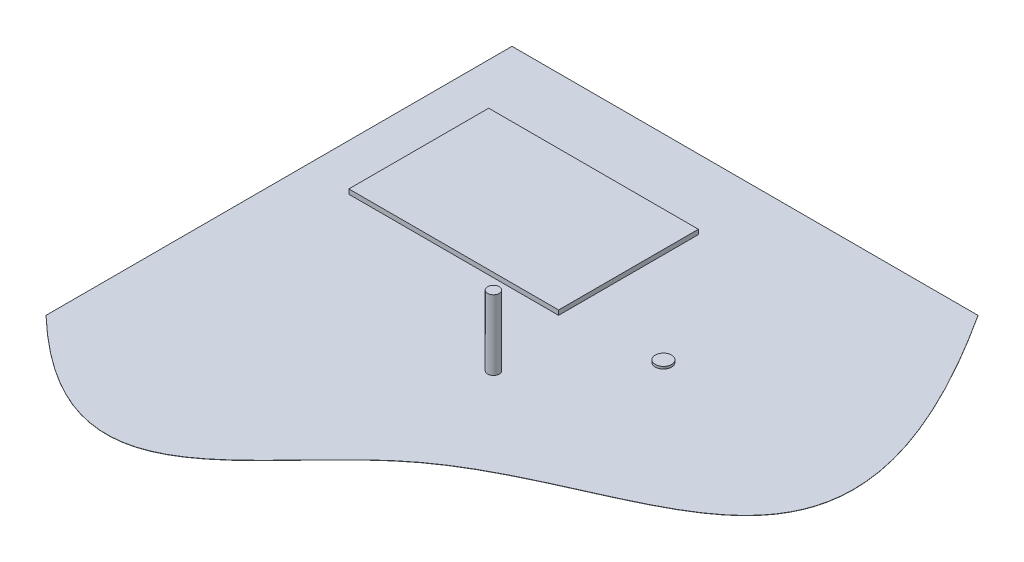
ISO-10303-21;
HEADER;
FILE_DESCRIPTION(('STEP AP214'),'2;1');
FILE_NAME('part.step','',(''),(''),'','','');
FILE_SCHEMA(('AUTOMOTIVE_DESIGN { 1 0 10303 214 1 1 1 1 }'));
ENDSEC;
DATA;
#1=APPLICATION_CONTEXT('core data for automotive mechanical design processes');
#2=APPLICATION_PROTOCOL_DEFINITION('international standard','automotive_design',2000,#1);
#3=PRODUCT_CONTEXT('',#1,'mechanical');
#4=PRODUCT('Part','Part','',(#3));
#5=PRODUCT_RELATED_PRODUCT_CATEGORY('part','',(#4));
#6=PRODUCT_DEFINITION_FORMATION('','',#4);
#7=PRODUCT_DEFINITION_CONTEXT('part definition',#1,'design');
#8=PRODUCT_DEFINITION('design','',#6,#7);
#9=PRODUCT_DEFINITION_SHAPE('','',#8);
#10=(LENGTH_UNIT() NAMED_UNIT(*) SI_UNIT(.MILLI.,.METRE.));
#11=(NAMED_UNIT(*) PLANE_ANGLE_UNIT() SI_UNIT($,.RADIAN.));
#12=(NAMED_UNIT(*) SI_UNIT($,.STERADIAN.) SOLID_ANGLE_UNIT());
#13=UNCERTAINTY_MEASURE_WITH_UNIT(LENGTH_MEASURE(1.E-05),#10,'distance_accuracy_value','');
#14=(GEOMETRIC_REPRESENTATION_CONTEXT(3) GLOBAL_UNCERTAINTY_ASSIGNED_CONTEXT((#13)) GLOBAL_UNIT_ASSIGNED_CONTEXT((#10,
#11,#12)) REPRESENTATION_CONTEXT('',''));
#15=CARTESIAN_POINT('',(0.,0.,0.));
#16=DIRECTION('',(0.,0.,1.));
#17=DIRECTION('',(1.,0.,0.));
#18=AXIS2_PLACEMENT_3D('',#15,#16,#17);
#19=CARTESIAN_POINT('',(11661.5896597515,3010.,12457.685557089));
#20=DIRECTION('',(0.,-1.,0.));
#21=DIRECTION('',(0.,0.,-1.));
#22=AXIS2_PLACEMENT_3D('',#19,#20,#21);
#23=CYLINDRICAL_SURFACE('',#22,249.999999999999);
#24=CARTESIAN_POINT('',(11661.5896597515,3010.,12457.685557089));
#25=DIRECTION('',(0.,1.,0.));
#26=DIRECTION('',(0.,0.,1.));
#27=AXIS2_PLACEMENT_3D('',#24,#25,#26);
#28=CIRCLE('',#27,249.999999999999);
#29=CARTESIAN_POINT('',(11661.5896597515,3010.,12707.685557089));
#30=VERTEX_POINT('',#29);
#31=EDGE_CURVE('E11',#30,#30,#28,.T.);
#32=ORIENTED_EDGE('',*,*,#31,.F.);
#33=EDGE_LOOP('',(#32));
#34=FACE_BOUND('',#33,.T.);
#35=CARTESIAN_POINT('',(11661.5896597515,10.,12457.685557089));
#36=DIRECTION('',(0.,1.,0.));
#37=DIRECTION('',(0.,0.,1.));
#38=AXIS2_PLACEMENT_3D('',#35,#36,#37);
#39=CIRCLE('',#38,249.999999999999);
#40=CARTESIAN_POINT('',(11661.5896597515,10.,12707.685557089));
#41=VERTEX_POINT('',#40);
#42=EDGE_CURVE('E57',#41,#41,#39,.T.);
#43=ORIENTED_EDGE('',*,*,#42,.T.);
#44=EDGE_LOOP('',(#43));
#45=FACE_BOUND('',#44,.T.);
#46=ADVANCED_FACE('F54',(#34,#45),#23,.T.);
#47=CARTESIAN_POINT('',(11661.5896597515,3010.,12457.685557089));
#48=DIRECTION('',(0.,1.,0.));
#49=DIRECTION('',(0.,0.,1.));
#50=AXIS2_PLACEMENT_3D('',#47,#48,#49);
#51=PLANE('',#50);
#52=ORIENTED_EDGE('',*,*,#31,.T.);
#53=EDGE_LOOP('',(#52));
#54=FACE_BOUND('',#53,.T.);
#55=ADVANCED_FACE('F69',(#54),#51,.T.);
#56=CARTESIAN_POINT('',(11661.5896597515,10.,12457.685557089));
#57=DIRECTION('',(0.,1.,0.));
#58=DIRECTION('',(0.,0.,1.));
#59=AXIS2_PLACEMENT_3D('',#56,#57,#58);
#60=PLANE('',#59);
#61=ORIENTED_EDGE('',*,*,#42,.F.);
#62=EDGE_LOOP('',(#61));
#63=FACE_BOUND('',#62,.T.);
#64=ADVANCED_FACE('F67',(#63),#60,.F.);
#65=CLOSED_SHELL('',(#46,#55,#64));
#66=MANIFOLD_SOLID_BREP('B2',#65);
#67=CARTESIAN_POINT('',(15000.,110.,8500.));
#68=DIRECTION('',(0.,-1.,0.));
#69=DIRECTION('',(0.,0.,-1.));
#70=AXIS2_PLACEMENT_3D('',#67,#68,#69);
#71=CYLINDRICAL_SURFACE('',#70,349.999999999999);
#72=CARTESIAN_POINT('',(15000.,110.,8500.));
#73=DIRECTION('',(0.,1.,0.));
#74=DIRECTION('',(0.,0.,1.));
#75=AXIS2_PLACEMENT_3D('',#72,#73,#74);
#76=CIRCLE('',#75,349.999999999999);
#77=CARTESIAN_POINT('',(15000.,110.,8850.));
#78=VERTEX_POINT('',#77);
#79=EDGE_CURVE('E53',#78,#78,#76,.T.);
#80=ORIENTED_EDGE('',*,*,#79,.F.);
#81=EDGE_LOOP('',(#80));
#82=FACE_BOUND('',#81,.T.);
#83=CARTESIAN_POINT('',(15000.,10.,8500.));
#84=DIRECTION('',(0.,1.,0.));
#85=DIRECTION('',(0.,0.,1.));
#86=AXIS2_PLACEMENT_3D('',#83,#84,#85);
#87=CIRCLE('',#86,349.999999999999);
#88=CARTESIAN_POINT('',(15000.,10.,8850.));
#89=VERTEX_POINT('',#88);
#90=EDGE_CURVE('E107',#89,#89,#87,.T.);
#91=ORIENTED_EDGE('',*,*,#90,.T.);
#92=EDGE_LOOP('',(#91));
#93=FACE_BOUND('',#92,.T.);
#94=ADVANCED_FACE('F104',(#82,#93),#71,.T.);
#95=CARTESIAN_POINT('',(15000.,110.,8500.));
#96=DIRECTION('',(0.,1.,0.));
#97=DIRECTION('',(0.,0.,1.));
#98=AXIS2_PLACEMENT_3D('',#95,#96,#97);
#99=PLANE('',#98);
#100=ORIENTED_EDGE('',*,*,#79,.T.);
#101=EDGE_LOOP('',(#100));
#102=FACE_BOUND('',#101,.T.);
#103=ADVANCED_FACE('F119',(#102),#99,.T.);
#104=CARTESIAN_POINT('',(15000.,10.,8500.));
#105=DIRECTION('',(0.,1.,0.));
#106=DIRECTION('',(0.,0.,1.));
#107=AXIS2_PLACEMENT_3D('',#104,#105,#106);
#108=PLANE('',#107);
#109=ORIENTED_EDGE('',*,*,#90,.F.);
#110=EDGE_LOOP('',(#109));
#111=FACE_BOUND('',#110,.T.);
#112=ADVANCED_FACE('F117',(#111),#108,.F.);
#113=CLOSED_SHELL('',(#94,#103,#112));
#114=MANIFOLD_SOLID_BREP('B6',#113);
#115=CARTESIAN_POINT('',(16145.9158350434,10.,15862.8564409124));
#116=DIRECTION('',(0.,-1.,0.));
#117=DIRECTION('',(0.,0.,-1.));
#118=AXIS2_PLACEMENT_3D('',#115,#116,#117);
#119=PLANE('',#118);
#120=DIRECTION('',(0.,0.,1.));
#121=VECTOR('',#120,1.);
#122=CARTESIAN_POINT('',(0.,10.,0.));
#123=LINE('',#122,#121);
#124=CARTESIAN_POINT('',(0.,10.,0.));
#125=VERTEX_POINT('',#124);
#126=CARTESIAN_POINT('',(2.44929359829471E-12,10.,20000.));
#127=VERTEX_POINT('',#126);
#128=EDGE_CURVE('E240',#125,#127,#123,.T.);
#129=ORIENTED_EDGE('',*,*,#128,.T.);
#130=CARTESIAN_POINT('',(2.44929359829471E-12,10.,20000.));
#131=CARTESIAN_POINT('',(7198.35283971014,10.,26864.519570208));
#132=CARTESIAN_POINT('',(12070.5057853964,10.,12028.8189776925));
#133=CARTESIAN_POINT('',(29348.4020602398,10.,14440.6963424072));
#134=CARTESIAN_POINT('',(20000.,10.,-8.01619678548039E-13));
#135=B_SPLINE_CURVE_WITH_KNOTS('',3,(#130,#131,#132,#133,#134),.UNSPECIFIED.,.F.,.F.,(4,1,4),
(0.,0.413559719713907,1.),.UNSPECIFIED.);
#136=CARTESIAN_POINT('',(20000.,10.,0.));
#137=VERTEX_POINT('',#136);
#138=EDGE_CURVE('E244',#127,#137,#135,.T.);
#139=ORIENTED_EDGE('',*,*,#138,.T.);
#140=DIRECTION('',(-1.,0.,0.));
#141=VECTOR('',#140,1.);
#142=CARTESIAN_POINT('',(0.,10.,0.));
#143=LINE('',#142,#141);
#144=EDGE_CURVE('E251',#137,#125,#143,.T.);
#145=ORIENTED_EDGE('',*,*,#144,.T.);
#146=EDGE_LOOP('',(#129,#139,#145));
#147=FACE_BOUND('',#146,.T.);
#148=DIRECTION('',(0.,0.,1.));
#149=VECTOR('',#148,1.);
#150=CARTESIAN_POINT('',(2000.,10.,3000.));
#151=LINE('',#150,#149);
#152=CARTESIAN_POINT('',(2000.,10.,3000.));
#153=VERTEX_POINT('',#152);
#154=CARTESIAN_POINT('',(2000.,10.,9000.));
#155=VERTEX_POINT('',#154);
#156=EDGE_CURVE('E227',#153,#155,#151,.T.);
#157=ORIENTED_EDGE('',*,*,#156,.F.);
#158=DIRECTION('',(-1.,0.,0.));
#159=VECTOR('',#158,1.);
#160=CARTESIAN_POINT('',(2000.,10.,3000.));
#161=LINE('',#160,#159);
#162=CARTESIAN_POINT('',(11000.,10.,3000.));
#163=VERTEX_POINT('',#162);
#164=EDGE_CURVE('E224',#163,#153,#161,.T.);
#165=ORIENTED_EDGE('',*,*,#164,.F.);
#166=DIRECTION('',(0.,0.,-1.));
#167=VECTOR('',#166,1.);
#168=CARTESIAN_POINT('',(11000.,10.,3000.));
#169=LINE('',#168,#167);
#170=CARTESIAN_POINT('',(11000.,10.,9000.));
#171=VERTEX_POINT('',#170);
#172=EDGE_CURVE('E166',#171,#163,#169,.T.);
#173=ORIENTED_EDGE('',*,*,#172,.F.);
#174=DIRECTION('',(1.,0.,0.));
#175=VECTOR('',#174,1.);
#176=CARTESIAN_POINT('',(2000.,10.,9000.));
#177=LINE('',#176,#175);
#178=EDGE_CURVE('E161',#155,#171,#177,.T.);
#179=ORIENTED_EDGE('',*,*,#178,.F.);
#180=EDGE_LOOP('',(#157,#165,#173,#179));
#181=FACE_BOUND('',#180,.T.);
#182=ADVANCED_FACE('F145',(#147,#181),#119,.F.);
#183=CARTESIAN_POINT('',(0.,10.,0.));
#184=DIRECTION('',(1.,0.,0.));
#185=DIRECTION('',(0.,0.,-1.));
#186=AXIS2_PLACEMENT_3D('',#183,#184,#185);
#187=PLANE('',#186);
#188=DIRECTION('',(0.,0.,1.));
#189=VECTOR('',#188,1.);
#190=CARTESIAN_POINT('',(0.,0.,0.));
#191=LINE('',#190,#189);
#192=CARTESIAN_POINT('',(0.,0.,0.));
#193=VERTEX_POINT('',#192);
#194=CARTESIAN_POINT('',(2.44929359829471E-12,0.,20000.));
#195=VERTEX_POINT('',#194);
#196=EDGE_CURVE('E229',#193,#195,#191,.T.);
#197=ORIENTED_EDGE('',*,*,#196,.T.);
#198=DIRECTION('',(0.,-1.,0.));
#199=VECTOR('',#198,1.);
#200=CARTESIAN_POINT('',(2.44929359829471E-12,10.,20000.));
#201=LINE('',#200,#199);
#202=EDGE_CURVE('E102',#127,#195,#201,.T.);
#203=ORIENTED_EDGE('',*,*,#202,.F.);
#204=ORIENTED_EDGE('',*,*,#128,.F.);
#205=DIRECTION('',(0.,-1.,0.));
#206=VECTOR('',#205,1.);
#207=CARTESIAN_POINT('',(0.,10.,0.));
#208=LINE('',#207,#206);
#209=EDGE_CURVE('E343',#125,#193,#208,.T.);
#210=ORIENTED_EDGE('',*,*,#209,.T.);
#211=EDGE_LOOP('',(#197,#203,#204,#210));
#212=FACE_BOUND('',#211,.T.);
#213=ADVANCED_FACE('F147',(#212),#187,.F.);
#214=DIRECTION('',(0.,-1.,0.));
#215=VECTOR('',#214,1.);
#216=SURFACE_OF_LINEAR_EXTRUSION('',#135,#215);
#217=CARTESIAN_POINT('',(2.44929359829471E-12,0.,20000.));
#218=CARTESIAN_POINT('',(7198.35283971014,0.,26864.519570208));
#219=CARTESIAN_POINT('',(12070.5057853964,0.,12028.8189776925));
#220=CARTESIAN_POINT('',(29348.4020602398,0.,14440.6963424072));
#221=CARTESIAN_POINT('',(20000.,0.,-8.01619678548039E-13));
#222=B_SPLINE_CURVE_WITH_KNOTS('',3,(#217,#218,#219,#220,#221),.UNSPECIFIED.,.F.,.F.,(4,1,4),
(0.,0.413559719713907,1.),.UNSPECIFIED.);
#223=CARTESIAN_POINT('',(20000.,0.,0.));
#224=VERTEX_POINT('',#223);
#225=EDGE_CURVE('E234',#195,#224,#222,.T.);
#226=ORIENTED_EDGE('',*,*,#225,.T.);
#227=DIRECTION('',(0.,-1.,0.));
#228=VECTOR('',#227,1.);
#229=CARTESIAN_POINT('',(20000.,10.,0.));
#230=LINE('',#229,#228);
#231=EDGE_CURVE('E154',#137,#224,#230,.T.);
#232=ORIENTED_EDGE('',*,*,#231,.F.);
#233=ORIENTED_EDGE('',*,*,#138,.F.);
#234=ORIENTED_EDGE('',*,*,#202,.T.);
#235=EDGE_LOOP('',(#226,#232,#233,#234));
#236=FACE_BOUND('',#235,.T.);
#237=ADVANCED_FACE('F255',(#236),#216,.F.);
#238=CARTESIAN_POINT('',(0.,10.,0.));
#239=DIRECTION('',(0.,0.,1.));
#240=DIRECTION('',(1.,0.,0.));
#241=AXIS2_PLACEMENT_3D('',#238,#239,#240);
#242=PLANE('',#241);
#243=DIRECTION('',(-1.,0.,0.));
#244=VECTOR('',#243,1.);
#245=CARTESIAN_POINT('',(0.,0.,0.));
#246=LINE('',#245,#244);
#247=EDGE_CURVE('E245',#224,#193,#246,.T.);
#248=ORIENTED_EDGE('',*,*,#247,.T.);
#249=ORIENTED_EDGE('',*,*,#209,.F.);
#250=ORIENTED_EDGE('',*,*,#144,.F.);
#251=ORIENTED_EDGE('',*,*,#231,.T.);
#252=EDGE_LOOP('',(#248,#249,#250,#251));
#253=FACE_BOUND('',#252,.T.);
#254=ADVANCED_FACE('F258',(#253),#242,.F.);
#255=CARTESIAN_POINT('',(16145.9158350434,0.,15862.8564409124));
#256=DIRECTION('',(0.,-1.,0.));
#257=DIRECTION('',(0.,0.,-1.));
#258=AXIS2_PLACEMENT_3D('',#255,#256,#257);
#259=PLANE('',#258);
#260=ORIENTED_EDGE('',*,*,#196,.F.);
#261=ORIENTED_EDGE('',*,*,#247,.F.);
#262=ORIENTED_EDGE('',*,*,#225,.F.);
#263=EDGE_LOOP('',(#260,#261,#262));
#264=FACE_BOUND('',#263,.T.);
#265=ADVANCED_FACE('F262',(#264),#259,.T.);
#266=CARTESIAN_POINT('',(2000.,210.,3000.));
#267=DIRECTION('',(1.,0.,0.));
#268=DIRECTION('',(0.,0.,-1.));
#269=AXIS2_PLACEMENT_3D('',#266,#267,#268);
#270=PLANE('',#269);
#271=ORIENTED_EDGE('',*,*,#156,.T.);
#272=DIRECTION('',(0.,-1.,0.));
#273=VECTOR('',#272,1.);
#274=CARTESIAN_POINT('',(2000.,210.,9000.));
#275=LINE('',#274,#273);
#276=CARTESIAN_POINT('',(2000.,210.,9000.));
#277=VERTEX_POINT('',#276);
#278=EDGE_CURVE('E206',#277,#155,#275,.T.);
#279=ORIENTED_EDGE('',*,*,#278,.F.);
#280=DIRECTION('',(0.,0.,1.));
#281=VECTOR('',#280,1.);
#282=CARTESIAN_POINT('',(2000.,210.,3000.));
#283=LINE('',#282,#281);
#284=CARTESIAN_POINT('',(2000.,210.,3000.));
#285=VERTEX_POINT('',#284);
#286=EDGE_CURVE('E214',#285,#277,#283,.T.);
#287=ORIENTED_EDGE('',*,*,#286,.F.);
#288=DIRECTION('',(0.,-1.,0.));
#289=VECTOR('',#288,1.);
#290=CARTESIAN_POINT('',(2000.,210.,3000.));
#291=LINE('',#290,#289);
#292=EDGE_CURVE('E365',#285,#153,#291,.T.);
#293=ORIENTED_EDGE('',*,*,#292,.T.);
#294=EDGE_LOOP('',(#271,#279,#287,#293));
#295=FACE_BOUND('',#294,.T.);
#296=ADVANCED_FACE('F226',(#295),#270,.F.);
#297=CARTESIAN_POINT('',(2000.,210.,9000.));
#298=DIRECTION('',(0.,0.,-1.));
#299=DIRECTION('',(-1.,0.,0.));
#300=AXIS2_PLACEMENT_3D('',#297,#298,#299);
#301=PLANE('',#300);
#302=ORIENTED_EDGE('',*,*,#178,.T.);
#303=DIRECTION('',(0.,-1.,0.));
#304=VECTOR('',#303,1.);
#305=CARTESIAN_POINT('',(11000.,210.,9000.));
#306=LINE('',#305,#304);
#307=CARTESIAN_POINT('',(11000.,210.,9000.));
#308=VERTEX_POINT('',#307);
#309=EDGE_CURVE('E209',#308,#171,#306,.T.);
#310=ORIENTED_EDGE('',*,*,#309,.F.);
#311=DIRECTION('',(1.,0.,0.));
#312=VECTOR('',#311,1.);
#313=CARTESIAN_POINT('',(2000.,210.,9000.));
#314=LINE('',#313,#312);
#315=EDGE_CURVE('E202',#277,#308,#314,.T.);
#316=ORIENTED_EDGE('',*,*,#315,.F.);
#317=ORIENTED_EDGE('',*,*,#278,.T.);
#318=EDGE_LOOP('',(#302,#310,#316,#317));
#319=FACE_BOUND('',#318,.T.);
#320=ADVANCED_FACE('F204',(#319),#301,.F.);
#321=CARTESIAN_POINT('',(11000.,210.,3000.));
#322=DIRECTION('',(-1.,0.,0.));
#323=DIRECTION('',(0.,0.,1.));
#324=AXIS2_PLACEMENT_3D('',#321,#322,#323);
#325=PLANE('',#324);
#326=ORIENTED_EDGE('',*,*,#172,.T.);
#327=DIRECTION('',(0.,-1.,0.));
#328=VECTOR('',#327,1.);
#329=CARTESIAN_POINT('',(11000.,210.,3000.));
#330=LINE('',#329,#328);
#331=CARTESIAN_POINT('',(11000.,210.,3000.));
#332=VERTEX_POINT('',#331);
#333=EDGE_CURVE('E236',#332,#163,#330,.T.);
#334=ORIENTED_EDGE('',*,*,#333,.F.);
#335=DIRECTION('',(0.,0.,-1.));
#336=VECTOR('',#335,1.);
#337=CARTESIAN_POINT('',(11000.,210.,3000.));
#338=LINE('',#337,#336);
#339=EDGE_CURVE('E213',#308,#332,#338,.T.);
#340=ORIENTED_EDGE('',*,*,#339,.F.);
#341=ORIENTED_EDGE('',*,*,#309,.T.);
#342=EDGE_LOOP('',(#326,#334,#340,#341));
#343=FACE_BOUND('',#342,.T.);
#344=ADVANCED_FACE('F274',(#343),#325,.F.);
#345=CARTESIAN_POINT('',(2000.,210.,3000.));
#346=DIRECTION('',(0.,0.,1.));
#347=DIRECTION('',(1.,0.,0.));
#348=AXIS2_PLACEMENT_3D('',#345,#346,#347);
#349=PLANE('',#348);
#350=ORIENTED_EDGE('',*,*,#164,.T.);
#351=ORIENTED_EDGE('',*,*,#292,.F.);
#352=DIRECTION('',(-1.,0.,0.));
#353=VECTOR('',#352,1.);
#354=CARTESIAN_POINT('',(2000.,210.,3000.));
#355=LINE('',#354,#353);
#356=EDGE_CURVE('E219',#332,#285,#355,.T.);
#357=ORIENTED_EDGE('',*,*,#356,.F.);
#358=ORIENTED_EDGE('',*,*,#333,.T.);
#359=EDGE_LOOP('',(#350,#351,#357,#358));
#360=FACE_BOUND('',#359,.T.);
#361=ADVANCED_FACE('F277',(#360),#349,.F.);
#362=CARTESIAN_POINT('',(0.,210.,0.));
#363=DIRECTION('',(0.,1.,0.));
#364=DIRECTION('',(0.,0.,1.));
#365=AXIS2_PLACEMENT_3D('',#362,#363,#364);
#366=PLANE('',#365);
#367=ORIENTED_EDGE('',*,*,#286,.T.);
#368=ORIENTED_EDGE('',*,*,#315,.T.);
#369=ORIENTED_EDGE('',*,*,#339,.T.);
#370=ORIENTED_EDGE('',*,*,#356,.T.);
#371=EDGE_LOOP('',(#367,#368,#369,#370));
#372=FACE_BOUND('',#371,.T.);
#373=ADVANCED_FACE('F217',(#372),#366,.T.);
#374=CLOSED_SHELL('',(#182,#213,#237,#254,#265,#296,#320,#344,#361,#373));
#375=MANIFOLD_SOLID_BREP('B48',#374);
#376=ADVANCED_BREP_SHAPE_REPRESENTATION('',(#18,#66,#114,#375),#14);
#377=SHAPE_DEFINITION_REPRESENTATION(#9,#376);
ENDSEC;
END-ISO-10303-21;
